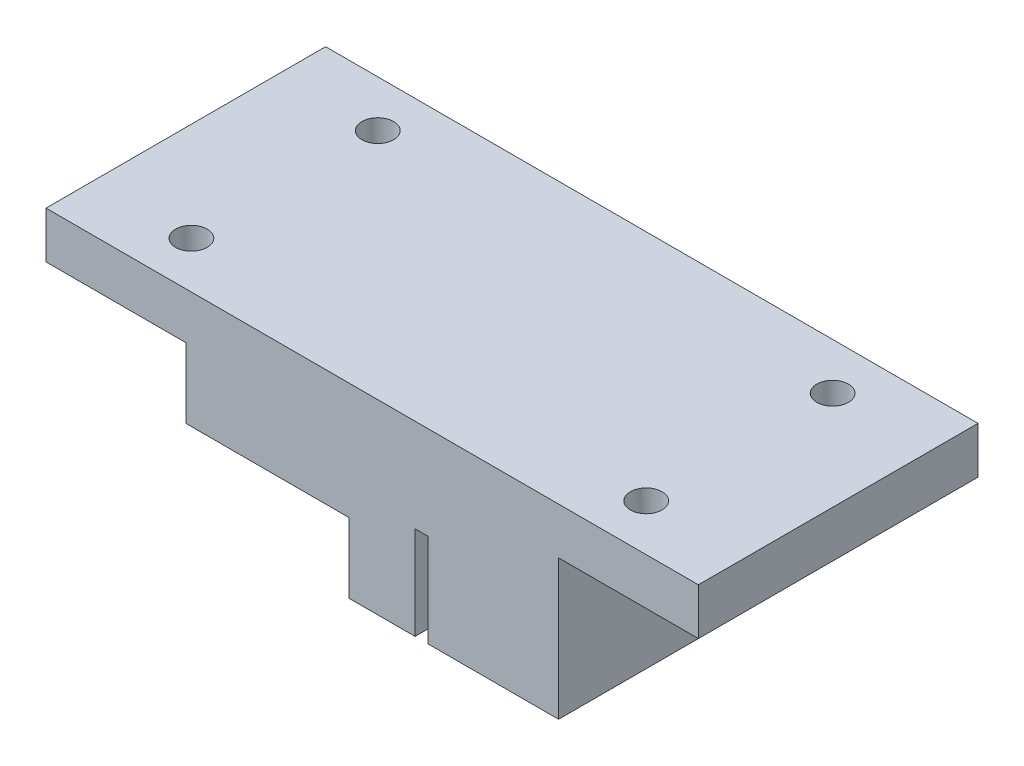
ISO-10303-21;
HEADER;
FILE_DESCRIPTION(('STEP AP214'),'2;1');
FILE_NAME('part.step','',(''),(''),'','','');
FILE_SCHEMA(('AUTOMOTIVE_DESIGN { 1 0 10303 214 1 1 1 1 }'));
ENDSEC;
DATA;
#1=APPLICATION_CONTEXT('core data for automotive mechanical design processes');
#2=APPLICATION_PROTOCOL_DEFINITION('international standard','automotive_design',2000,#1);
#3=PRODUCT_CONTEXT('',#1,'mechanical');
#4=PRODUCT('Part','Part','',(#3));
#5=PRODUCT_RELATED_PRODUCT_CATEGORY('part','',(#4));
#6=PRODUCT_DEFINITION_FORMATION('','',#4);
#7=PRODUCT_DEFINITION_CONTEXT('part definition',#1,'design');
#8=PRODUCT_DEFINITION('design','',#6,#7);
#9=PRODUCT_DEFINITION_SHAPE('','',#8);
#10=(LENGTH_UNIT() NAMED_UNIT(*) SI_UNIT(.MILLI.,.METRE.));
#11=(NAMED_UNIT(*) PLANE_ANGLE_UNIT() SI_UNIT($,.RADIAN.));
#12=(NAMED_UNIT(*) SI_UNIT($,.STERADIAN.) SOLID_ANGLE_UNIT());
#13=UNCERTAINTY_MEASURE_WITH_UNIT(LENGTH_MEASURE(1.E-05),#10,'distance_accuracy_value','');
#14=(GEOMETRIC_REPRESENTATION_CONTEXT(3) GLOBAL_UNCERTAINTY_ASSIGNED_CONTEXT((#13)) GLOBAL_UNIT_ASSIGNED_CONTEXT((#10,
#11,#12)) REPRESENTATION_CONTEXT('',''));
#15=CARTESIAN_POINT('',(0.,0.,0.));
#16=DIRECTION('',(0.,0.,1.));
#17=DIRECTION('',(1.,0.,0.));
#18=AXIS2_PLACEMENT_3D('',#15,#16,#17);
#19=CARTESIAN_POINT('',(-44.45,6.35,-19.05));
#20=DIRECTION('',(0.,0.,1.));
#21=DIRECTION('',(1.,0.,0.));
#22=AXIS2_PLACEMENT_3D('',#19,#20,#21);
#23=PLANE('',#22);
#24=DIRECTION('',(0.,-1.,0.));
#25=VECTOR('',#24,1.);
#26=CARTESIAN_POINT('',(7.62000000000001,-6.35,-19.05));
#27=LINE('',#26,#25);
#28=CARTESIAN_POINT('',(7.62000000000001,-6.35,-19.05));
#29=VERTEX_POINT('',#28);
#30=CARTESIAN_POINT('',(7.62000000000001,-19.05,-19.05));
#31=VERTEX_POINT('',#30);
#32=EDGE_CURVE('E277',#29,#31,#27,.T.);
#33=ORIENTED_EDGE('',*,*,#32,.F.);
#34=DIRECTION('',(-1.,0.,0.));
#35=VECTOR('',#34,1.);
#36=CARTESIAN_POINT('',(7.62000000000001,-6.35,-19.05));
#37=LINE('',#36,#35);
#38=CARTESIAN_POINT('',(5.84200000000001,-6.35,-19.05));
#39=VERTEX_POINT('',#38);
#40=EDGE_CURVE('E228',#29,#39,#37,.T.);
#41=ORIENTED_EDGE('',*,*,#40,.T.);
#42=DIRECTION('',(0.,-1.,0.));
#43=VECTOR('',#42,1.);
#44=CARTESIAN_POINT('',(5.84200000000001,-6.35,-19.05));
#45=LINE('',#44,#43);
#46=CARTESIAN_POINT('',(5.84200000000001,-19.05,-19.05));
#47=VERTEX_POINT('',#46);
#48=EDGE_CURVE('E274',#39,#47,#45,.T.);
#49=ORIENTED_EDGE('',*,*,#48,.T.);
#50=DIRECTION('',(1.,0.,0.));
#51=VECTOR('',#50,1.);
#52=CARTESIAN_POINT('',(-25.4,-19.05,-19.05));
#53=LINE('',#52,#51);
#54=CARTESIAN_POINT('',(-3.175,-19.05,-19.05));
#55=VERTEX_POINT('',#54);
#56=EDGE_CURVE('E310',#55,#47,#53,.T.);
#57=ORIENTED_EDGE('',*,*,#56,.F.);
#58=DIRECTION('',(0.,-1.,0.));
#59=VECTOR('',#58,1.);
#60=CARTESIAN_POINT('',(-3.175,-9.525,-19.05));
#61=LINE('',#60,#59);
#62=CARTESIAN_POINT('',(-3.175,-9.525,-19.05));
#63=VERTEX_POINT('',#62);
#64=EDGE_CURVE('E65',#63,#55,#61,.T.);
#65=ORIENTED_EDGE('',*,*,#64,.F.);
#66=DIRECTION('',(1.,0.,0.));
#67=VECTOR('',#66,1.);
#68=CARTESIAN_POINT('',(-25.4,-9.525,-19.05));
#69=LINE('',#68,#67);
#70=CARTESIAN_POINT('',(-25.4,-9.525,-19.05));
#71=VERTEX_POINT('',#70);
#72=EDGE_CURVE('E288',#71,#63,#69,.T.);
#73=ORIENTED_EDGE('',*,*,#72,.F.);
#74=DIRECTION('',(0.,1.,0.));
#75=VECTOR('',#74,1.);
#76=CARTESIAN_POINT('',(-25.4,-19.05,-19.05));
#77=LINE('',#76,#75);
#78=CARTESIAN_POINT('',(-25.4,0.,-19.05));
#79=VERTEX_POINT('',#78);
#80=EDGE_CURVE('E326',#71,#79,#77,.T.);
#81=ORIENTED_EDGE('',*,*,#80,.T.);
#82=DIRECTION('',(-1.,0.,0.));
#83=VECTOR('',#82,1.);
#84=CARTESIAN_POINT('',(-44.45,0.,-19.05));
#85=LINE('',#84,#83);
#86=CARTESIAN_POINT('',(-44.45,0.,-19.05));
#87=VERTEX_POINT('',#86);
#88=EDGE_CURVE('E355',#79,#87,#85,.T.);
#89=ORIENTED_EDGE('',*,*,#88,.T.);
#90=DIRECTION('',(0.,-1.,0.));
#91=VECTOR('',#90,1.);
#92=CARTESIAN_POINT('',(-44.45,6.35,-19.05));
#93=LINE('',#92,#91);
#94=CARTESIAN_POINT('',(-44.45,6.35,-19.05));
#95=VERTEX_POINT('',#94);
#96=EDGE_CURVE('E49',#95,#87,#93,.T.);
#97=ORIENTED_EDGE('',*,*,#96,.F.);
#98=DIRECTION('',(-1.,0.,0.));
#99=VECTOR('',#98,1.);
#100=CARTESIAN_POINT('',(-44.45,6.35,-19.05));
#101=LINE('',#100,#99);
#102=CARTESIAN_POINT('',(44.45,6.35,-19.05));
#103=VERTEX_POINT('',#102);
#104=EDGE_CURVE('E364',#103,#95,#101,.T.);
#105=ORIENTED_EDGE('',*,*,#104,.F.);
#106=DIRECTION('',(0.,-1.,0.));
#107=VECTOR('',#106,1.);
#108=CARTESIAN_POINT('',(44.45,6.35,-19.05));
#109=LINE('',#108,#107);
#110=CARTESIAN_POINT('',(44.45,0.,-19.05));
#111=VERTEX_POINT('',#110);
#112=EDGE_CURVE('E12',#103,#111,#109,.T.);
#113=ORIENTED_EDGE('',*,*,#112,.T.);
#114=CARTESIAN_POINT('',(25.4,0.,-19.05));
#115=VERTEX_POINT('',#114);
#116=EDGE_CURVE('E387',#111,#115,#85,.T.);
#117=ORIENTED_EDGE('',*,*,#116,.T.);
#118=DIRECTION('',(0.,1.,0.));
#119=VECTOR('',#118,1.);
#120=CARTESIAN_POINT('',(25.4,-19.05,-19.05));
#121=LINE('',#120,#119);
#122=CARTESIAN_POINT('',(25.4,-19.05,-19.05));
#123=VERTEX_POINT('',#122);
#124=EDGE_CURVE('E313',#123,#115,#121,.T.);
#125=ORIENTED_EDGE('',*,*,#124,.F.);
#126=EDGE_CURVE('E309',#31,#123,#53,.T.);
#127=ORIENTED_EDGE('',*,*,#126,.F.);
#128=EDGE_LOOP('',(#33,#41,#49,#57,#65,#73,#81,#89,#97,#105,#113,#117,#125,#127));
#129=FACE_BOUND('',#128,.T.);
#130=ADVANCED_FACE('F39',(#129),#23,.F.);
#131=CARTESIAN_POINT('',(-44.45,6.35,19.05));
#132=DIRECTION('',(0.,0.,-1.));
#133=DIRECTION('',(-1.,0.,0.));
#134=AXIS2_PLACEMENT_3D('',#131,#132,#133);
#135=PLANE('',#134);
#136=DIRECTION('',(0.,-1.,0.));
#137=VECTOR('',#136,1.);
#138=CARTESIAN_POINT('',(7.62,-6.35,19.0500000000001));
#139=LINE('',#138,#137);
#140=CARTESIAN_POINT('',(7.62,-6.35,19.0500000000001));
#141=VERTEX_POINT('',#140);
#142=CARTESIAN_POINT('',(7.62,-19.05,19.0500000000001));
#143=VERTEX_POINT('',#142);
#144=EDGE_CURVE('E205',#141,#143,#139,.T.);
#145=ORIENTED_EDGE('',*,*,#144,.T.);
#146=DIRECTION('',(-1.,0.,0.));
#147=VECTOR('',#146,1.);
#148=CARTESIAN_POINT('',(-25.4,-19.05,19.0500000000001));
#149=LINE('',#148,#147);
#150=CARTESIAN_POINT('',(25.4,-19.05,19.0500000000001));
#151=VERTEX_POINT('',#150);
#152=EDGE_CURVE('E307',#151,#143,#149,.T.);
#153=ORIENTED_EDGE('',*,*,#152,.F.);
#154=DIRECTION('',(0.,1.,0.));
#155=VECTOR('',#154,1.);
#156=CARTESIAN_POINT('',(25.4,-19.05,19.0500000000001));
#157=LINE('',#156,#155);
#158=CARTESIAN_POINT('',(25.4,0.,19.05));
#159=VERTEX_POINT('',#158);
#160=EDGE_CURVE('E333',#151,#159,#157,.T.);
#161=ORIENTED_EDGE('',*,*,#160,.T.);
#162=DIRECTION('',(1.,0.,0.));
#163=VECTOR('',#162,1.);
#164=CARTESIAN_POINT('',(-44.45,0.,19.05));
#165=LINE('',#164,#163);
#166=CARTESIAN_POINT('',(44.45,0.,19.05));
#167=VERTEX_POINT('',#166);
#168=EDGE_CURVE('E361',#159,#167,#165,.T.);
#169=ORIENTED_EDGE('',*,*,#168,.T.);
#170=DIRECTION('',(0.,-1.,0.));
#171=VECTOR('',#170,1.);
#172=CARTESIAN_POINT('',(44.45,6.35,19.05));
#173=LINE('',#172,#171);
#174=CARTESIAN_POINT('',(44.45,6.35,19.05));
#175=VERTEX_POINT('',#174);
#176=EDGE_CURVE('E375',#175,#167,#173,.T.);
#177=ORIENTED_EDGE('',*,*,#176,.F.);
#178=DIRECTION('',(1.,0.,0.));
#179=VECTOR('',#178,1.);
#180=CARTESIAN_POINT('',(-44.45,6.35,19.05));
#181=LINE('',#180,#179);
#182=CARTESIAN_POINT('',(-44.45,6.35,19.05));
#183=VERTEX_POINT('',#182);
#184=EDGE_CURVE('E379',#183,#175,#181,.T.);
#185=ORIENTED_EDGE('',*,*,#184,.F.);
#186=DIRECTION('',(0.,-1.,0.));
#187=VECTOR('',#186,1.);
#188=CARTESIAN_POINT('',(-44.45,6.35,19.05));
#189=LINE('',#188,#187);
#190=CARTESIAN_POINT('',(-44.45,0.,19.05));
#191=VERTEX_POINT('',#190);
#192=EDGE_CURVE('E359',#183,#191,#189,.T.);
#193=ORIENTED_EDGE('',*,*,#192,.T.);
#194=CARTESIAN_POINT('',(-25.4,0.,19.05));
#195=VERTEX_POINT('',#194);
#196=EDGE_CURVE('E354',#191,#195,#165,.T.);
#197=ORIENTED_EDGE('',*,*,#196,.T.);
#198=DIRECTION('',(0.,1.,0.));
#199=VECTOR('',#198,1.);
#200=CARTESIAN_POINT('',(-25.4,-19.05,19.0500000000001));
#201=LINE('',#200,#199);
#202=CARTESIAN_POINT('',(-25.4,-9.525,19.0500000000001));
#203=VERTEX_POINT('',#202);
#204=EDGE_CURVE('E43',#203,#195,#201,.T.);
#205=ORIENTED_EDGE('',*,*,#204,.F.);
#206=DIRECTION('',(-1.,0.,0.));
#207=VECTOR('',#206,1.);
#208=CARTESIAN_POINT('',(-25.4,-9.525,19.0500000000001));
#209=LINE('',#208,#207);
#210=CARTESIAN_POINT('',(-3.175,-9.525,19.0500000000001));
#211=VERTEX_POINT('',#210);
#212=EDGE_CURVE('E294',#211,#203,#209,.T.);
#213=ORIENTED_EDGE('',*,*,#212,.F.);
#214=DIRECTION('',(0.,-1.,0.));
#215=VECTOR('',#214,1.);
#216=CARTESIAN_POINT('',(-3.175,-9.525,19.0500000000001));
#217=LINE('',#216,#215);
#218=CARTESIAN_POINT('',(-3.175,-19.05,19.0500000000001));
#219=VERTEX_POINT('',#218);
#220=EDGE_CURVE('E297',#211,#219,#217,.T.);
#221=ORIENTED_EDGE('',*,*,#220,.T.);
#222=CARTESIAN_POINT('',(5.84200000000001,-19.05,19.0500000000001));
#223=VERTEX_POINT('',#222);
#224=EDGE_CURVE('E305',#223,#219,#149,.T.);
#225=ORIENTED_EDGE('',*,*,#224,.F.);
#226=DIRECTION('',(0.,-1.,0.));
#227=VECTOR('',#226,1.);
#228=CARTESIAN_POINT('',(5.84200000000001,-6.35,19.0500000000001));
#229=LINE('',#228,#227);
#230=CARTESIAN_POINT('',(5.84200000000001,-6.35,19.0500000000001));
#231=VERTEX_POINT('',#230);
#232=EDGE_CURVE('E57',#231,#223,#229,.T.);
#233=ORIENTED_EDGE('',*,*,#232,.F.);
#234=DIRECTION('',(1.,0.,0.));
#235=VECTOR('',#234,1.);
#236=CARTESIAN_POINT('',(5.84200000000001,-6.35,19.0500000000001));
#237=LINE('',#236,#235);
#238=EDGE_CURVE('E198',#231,#141,#237,.T.);
#239=ORIENTED_EDGE('',*,*,#238,.T.);
#240=EDGE_LOOP('',(#145,#153,#161,#169,#177,#185,#193,#197,#205,#213,#221,#225,#233,#239));
#241=FACE_BOUND('',#240,.T.);
#242=ADVANCED_FACE('F214',(#241),#135,.F.);
#243=CARTESIAN_POINT('',(0.,-19.05,0.));
#244=DIRECTION('',(0.,-1.,0.));
#245=DIRECTION('',(0.,0.,-1.));
#246=AXIS2_PLACEMENT_3D('',#243,#244,#245);
#247=PLANE('',#246);
#248=ORIENTED_EDGE('',*,*,#152,.T.);
#249=DIRECTION('',(0.,0.,-1.));
#250=VECTOR('',#249,1.);
#251=CARTESIAN_POINT('',(7.62,-19.05,19.0500000000001));
#252=LINE('',#251,#250);
#253=CARTESIAN_POINT('',(7.62000000000001,-19.05,8.12800000000011));
#254=VERTEX_POINT('',#253);
#255=EDGE_CURVE('E208',#143,#254,#252,.T.);
#256=ORIENTED_EDGE('',*,*,#255,.T.);
#257=DIRECTION('',(1.,0.,0.));
#258=VECTOR('',#257,1.);
#259=CARTESIAN_POINT('',(7.62000000000001,-19.05,8.12800000000011));
#260=LINE('',#259,#258);
#261=CARTESIAN_POINT('',(21.59,-19.05,8.12800000000011));
#262=VERTEX_POINT('',#261);
#263=EDGE_CURVE('E242',#254,#262,#260,.T.);
#264=ORIENTED_EDGE('',*,*,#263,.T.);
#265=DIRECTION('',(0.,0.,-1.));
#266=VECTOR('',#265,1.);
#267=CARTESIAN_POINT('',(21.59,-19.05,8.12800000000011));
#268=LINE('',#267,#266);
#269=CARTESIAN_POINT('',(21.59,-19.05,-8.12800000000001));
#270=VERTEX_POINT('',#269);
#271=EDGE_CURVE('E245',#262,#270,#268,.T.);
#272=ORIENTED_EDGE('',*,*,#271,.T.);
#273=DIRECTION('',(-1.,0.,0.));
#274=VECTOR('',#273,1.);
#275=CARTESIAN_POINT('',(21.59,-19.05,-8.12800000000001));
#276=LINE('',#275,#274);
#277=CARTESIAN_POINT('',(7.62000000000001,-19.05,-8.12800000000001));
#278=VERTEX_POINT('',#277);
#279=EDGE_CURVE('E248',#270,#278,#276,.T.);
#280=ORIENTED_EDGE('',*,*,#279,.T.);
#281=DIRECTION('',(0.,0.,-1.));
#282=VECTOR('',#281,1.);
#283=CARTESIAN_POINT('',(7.62000000000001,-19.05,-8.12800000000001));
#284=LINE('',#283,#282);
#285=EDGE_CURVE('E251',#278,#31,#284,.T.);
#286=ORIENTED_EDGE('',*,*,#285,.T.);
#287=ORIENTED_EDGE('',*,*,#126,.T.);
#288=DIRECTION('',(0.,0.,1.));
#289=VECTOR('',#288,1.);
#290=CARTESIAN_POINT('',(25.4,-19.05,19.0500000000001));
#291=LINE('',#290,#289);
#292=EDGE_CURVE('E302',#123,#151,#291,.T.);
#293=ORIENTED_EDGE('',*,*,#292,.T.);
#294=EDGE_LOOP('',(#248,#256,#264,#272,#280,#286,#287,#293));
#295=FACE_BOUND('',#294,.T.);
#296=ADVANCED_FACE('F442',(#295),#247,.T.);
#297=ORIENTED_EDGE('',*,*,#56,.T.);
#298=DIRECTION('',(0.,0.,1.));
#299=VECTOR('',#298,1.);
#300=CARTESIAN_POINT('',(5.84200000000001,-19.05,-19.05));
#301=LINE('',#300,#299);
#302=CARTESIAN_POINT('',(5.84200000000001,-19.05,-6.35000000000001));
#303=VERTEX_POINT('',#302);
#304=EDGE_CURVE('E254',#47,#303,#301,.T.);
#305=ORIENTED_EDGE('',*,*,#304,.T.);
#306=DIRECTION('',(1.,0.,0.));
#307=VECTOR('',#306,1.);
#308=CARTESIAN_POINT('',(5.84200000000001,-19.05,-6.35000000000001));
#309=LINE('',#308,#307);
#310=CARTESIAN_POINT('',(19.812,-19.05,-6.35000000000001));
#311=VERTEX_POINT('',#310);
#312=EDGE_CURVE('E257',#303,#311,#309,.T.);
#313=ORIENTED_EDGE('',*,*,#312,.T.);
#314=DIRECTION('',(0.,0.,1.));
#315=VECTOR('',#314,1.);
#316=CARTESIAN_POINT('',(19.812,-19.05,-6.35000000000001));
#317=LINE('',#316,#315);
#318=CARTESIAN_POINT('',(19.812,-19.05,6.35000000000011));
#319=VERTEX_POINT('',#318);
#320=EDGE_CURVE('E260',#311,#319,#317,.T.);
#321=ORIENTED_EDGE('',*,*,#320,.T.);
#322=DIRECTION('',(-1.,0.,0.));
#323=VECTOR('',#322,1.);
#324=CARTESIAN_POINT('',(19.812,-19.05,6.35000000000011));
#325=LINE('',#324,#323);
#326=CARTESIAN_POINT('',(5.84200000000001,-19.05,6.35000000000011));
#327=VERTEX_POINT('',#326);
#328=EDGE_CURVE('E218',#319,#327,#325,.T.);
#329=ORIENTED_EDGE('',*,*,#328,.T.);
#330=DIRECTION('',(0.,0.,1.));
#331=VECTOR('',#330,1.);
#332=CARTESIAN_POINT('',(5.84200000000001,-19.05,6.35000000000011));
#333=LINE('',#332,#331);
#334=EDGE_CURVE('E216',#327,#223,#333,.T.);
#335=ORIENTED_EDGE('',*,*,#334,.T.);
#336=ORIENTED_EDGE('',*,*,#224,.T.);
#337=DIRECTION('',(0.,0.,1.));
#338=VECTOR('',#337,1.);
#339=CARTESIAN_POINT('',(-3.175,-19.05,19.0500000000001));
#340=LINE('',#339,#338);
#341=EDGE_CURVE('E211',#55,#219,#340,.T.);
#342=ORIENTED_EDGE('',*,*,#341,.F.);
#343=EDGE_LOOP('',(#297,#305,#313,#321,#329,#335,#336,#342));
#344=FACE_BOUND('',#343,.T.);
#345=ADVANCED_FACE('F486',(#344),#247,.T.);
#346=CARTESIAN_POINT('',(-25.4,-19.05,19.0500000000001));
#347=DIRECTION('',(1.,0.,0.));
#348=DIRECTION('',(0.,0.,-1.));
#349=AXIS2_PLACEMENT_3D('',#346,#347,#348);
#350=PLANE('',#349);
#351=DIRECTION('',(0.,0.,-1.));
#352=VECTOR('',#351,1.);
#353=CARTESIAN_POINT('',(-25.4,-9.525,19.0500000000001));
#354=LINE('',#353,#352);
#355=EDGE_CURVE('E286',#203,#71,#354,.T.);
#356=ORIENTED_EDGE('',*,*,#355,.F.);
#357=ORIENTED_EDGE('',*,*,#204,.T.);
#358=DIRECTION('',(0.,0.,-1.));
#359=VECTOR('',#358,1.);
#360=CARTESIAN_POINT('',(-25.4,0.,19.0500000000001));
#361=LINE('',#360,#359);
#362=EDGE_CURVE('E306',#195,#79,#361,.T.);
#363=ORIENTED_EDGE('',*,*,#362,.T.);
#364=ORIENTED_EDGE('',*,*,#80,.F.);
#365=EDGE_LOOP('',(#356,#357,#363,#364));
#366=FACE_BOUND('',#365,.T.);
#367=ADVANCED_FACE('F345',(#366),#350,.F.);
#368=CARTESIAN_POINT('',(0.,0.,0.));
#369=DIRECTION('',(0.,1.,0.));
#370=DIRECTION('',(0.,0.,1.));
#371=AXIS2_PLACEMENT_3D('',#368,#369,#370);
#372=PLANE('',#371);
#373=CARTESIAN_POINT('',(30.988,0.,12.7));
#374=DIRECTION('',(0.,1.,0.));
#375=DIRECTION('',(0.,0.,1.));
#376=AXIS2_PLACEMENT_3D('',#373,#374,#375);
#377=CIRCLE('',#376,2.159);
#378=CARTESIAN_POINT('',(30.988,0.,14.859));
#379=VERTEX_POINT('',#378);
#380=EDGE_CURVE('E414',#379,#379,#377,.F.);
#381=ORIENTED_EDGE('',*,*,#380,.F.);
#382=EDGE_LOOP('',(#381));
#383=FACE_BOUND('',#382,.T.);
#384=CARTESIAN_POINT('',(30.988,0.,-12.7));
#385=DIRECTION('',(0.,1.,0.));
#386=DIRECTION('',(0.,0.,1.));
#387=AXIS2_PLACEMENT_3D('',#384,#385,#386);
#388=CIRCLE('',#387,2.159);
#389=CARTESIAN_POINT('',(30.988,0.,-10.541));
#390=VERTEX_POINT('',#389);
#391=EDGE_CURVE('E405',#390,#390,#388,.T.);
#392=ORIENTED_EDGE('',*,*,#391,.T.);
#393=EDGE_LOOP('',(#392));
#394=FACE_BOUND('',#393,.T.);
#395=DIRECTION('',(0.,0.,1.));
#396=VECTOR('',#395,1.);
#397=CARTESIAN_POINT('',(25.4,0.,19.0500000000001));
#398=LINE('',#397,#396);
#399=EDGE_CURVE('E300',#115,#159,#398,.T.);
#400=ORIENTED_EDGE('',*,*,#399,.F.);
#401=ORIENTED_EDGE('',*,*,#116,.F.);
#402=DIRECTION('',(0.,0.,-1.));
#403=VECTOR('',#402,1.);
#404=CARTESIAN_POINT('',(44.45,0.,-19.05));
#405=LINE('',#404,#403);
#406=EDGE_CURVE('E390',#167,#111,#405,.T.);
#407=ORIENTED_EDGE('',*,*,#406,.F.);
#408=ORIENTED_EDGE('',*,*,#168,.F.);
#409=EDGE_LOOP('',(#400,#401,#407,#408));
#410=FACE_BOUND('',#409,.T.);
#411=ADVANCED_FACE('F449',(#383,#394,#410),#372,.F.);
#412=CARTESIAN_POINT('',(-30.988,0.,12.7));
#413=DIRECTION('',(0.,1.,0.));
#414=DIRECTION('',(0.,0.,1.));
#415=AXIS2_PLACEMENT_3D('',#412,#413,#414);
#416=CIRCLE('',#415,2.159);
#417=CARTESIAN_POINT('',(-30.988,0.,14.859));
#418=VERTEX_POINT('',#417);
#419=EDGE_CURVE('E338',#418,#418,#416,.T.);
#420=ORIENTED_EDGE('',*,*,#419,.T.);
#421=EDGE_LOOP('',(#420));
#422=FACE_BOUND('',#421,.T.);
#423=CARTESIAN_POINT('',(-30.988,0.,-12.7));
#424=DIRECTION('',(0.,1.,0.));
#425=DIRECTION('',(0.,0.,1.));
#426=AXIS2_PLACEMENT_3D('',#423,#424,#425);
#427=CIRCLE('',#426,2.159);
#428=CARTESIAN_POINT('',(-30.988,0.,-10.541));
#429=VERTEX_POINT('',#428);
#430=EDGE_CURVE('E396',#429,#429,#427,.F.);
#431=ORIENTED_EDGE('',*,*,#430,.F.);
#432=EDGE_LOOP('',(#431));
#433=FACE_BOUND('',#432,.T.);
#434=ORIENTED_EDGE('',*,*,#362,.F.);
#435=ORIENTED_EDGE('',*,*,#196,.F.);
#436=DIRECTION('',(0.,0.,1.));
#437=VECTOR('',#436,1.);
#438=CARTESIAN_POINT('',(-44.45,0.,-19.05));
#439=LINE('',#438,#437);
#440=EDGE_CURVE('E366',#87,#191,#439,.T.);
#441=ORIENTED_EDGE('',*,*,#440,.F.);
#442=ORIENTED_EDGE('',*,*,#88,.F.);
#443=EDGE_LOOP('',(#434,#435,#441,#442));
#444=FACE_BOUND('',#443,.T.);
#445=ADVANCED_FACE('F352',(#422,#433,#444),#372,.F.);
#446=CARTESIAN_POINT('',(0.,6.35,0.));
#447=DIRECTION('',(0.,1.,0.));
#448=DIRECTION('',(0.,0.,1.));
#449=AXIS2_PLACEMENT_3D('',#446,#447,#448);
#450=PLANE('',#449);
#451=CARTESIAN_POINT('',(30.988,6.35,-12.7));
#452=DIRECTION('',(0.,1.,0.));
#453=DIRECTION('',(0.,0.,1.));
#454=AXIS2_PLACEMENT_3D('',#451,#452,#453);
#455=CIRCLE('',#454,2.159);
#456=CARTESIAN_POINT('',(30.988,6.35,-10.541));
#457=VERTEX_POINT('',#456);
#458=EDGE_CURVE('E406',#457,#457,#455,.F.);
#459=ORIENTED_EDGE('',*,*,#458,.T.);
#460=EDGE_LOOP('',(#459));
#461=FACE_BOUND('',#460,.T.);
#462=CARTESIAN_POINT('',(-30.988,6.35,-12.7));
#463=DIRECTION('',(0.,1.,0.));
#464=DIRECTION('',(0.,0.,1.));
#465=AXIS2_PLACEMENT_3D('',#462,#463,#464);
#466=CIRCLE('',#465,2.159);
#467=CARTESIAN_POINT('',(-30.988,6.35,-10.541));
#468=VERTEX_POINT('',#467);
#469=EDGE_CURVE('E402',#468,#468,#466,.T.);
#470=ORIENTED_EDGE('',*,*,#469,.F.);
#471=EDGE_LOOP('',(#470));
#472=FACE_BOUND('',#471,.T.);
#473=DIRECTION('',(0.,0.,-1.));
#474=VECTOR('',#473,1.);
#475=CARTESIAN_POINT('',(44.45,6.35,-19.05));
#476=LINE('',#475,#474);
#477=EDGE_CURVE('E360',#175,#103,#476,.T.);
#478=ORIENTED_EDGE('',*,*,#477,.T.);
#479=ORIENTED_EDGE('',*,*,#104,.T.);
#480=DIRECTION('',(0.,0.,1.));
#481=VECTOR('',#480,1.);
#482=CARTESIAN_POINT('',(-44.45,6.35,-19.05));
#483=LINE('',#482,#481);
#484=EDGE_CURVE('E385',#95,#183,#483,.T.);
#485=ORIENTED_EDGE('',*,*,#484,.T.);
#486=ORIENTED_EDGE('',*,*,#184,.T.);
#487=EDGE_LOOP('',(#478,#479,#485,#486));
#488=FACE_BOUND('',#487,.T.);
#489=CARTESIAN_POINT('',(30.988,6.35,12.7));
#490=DIRECTION('',(0.,1.,0.));
#491=DIRECTION('',(0.,0.,1.));
#492=AXIS2_PLACEMENT_3D('',#489,#490,#491);
#493=CIRCLE('',#492,2.159);
#494=CARTESIAN_POINT('',(30.988,6.35,14.859));
#495=VERTEX_POINT('',#494);
#496=EDGE_CURVE('E409',#495,#495,#493,.T.);
#497=ORIENTED_EDGE('',*,*,#496,.F.);
#498=EDGE_LOOP('',(#497));
#499=FACE_BOUND('',#498,.T.);
#500=CARTESIAN_POINT('',(-30.988,6.35,12.7));
#501=DIRECTION('',(0.,-1.,0.));
#502=DIRECTION('',(0.,0.,-1.));
#503=AXIS2_PLACEMENT_3D('',#500,#501,#502);
#504=CIRCLE('',#503,2.159);
#505=CARTESIAN_POINT('',(-30.988,6.35,10.541));
#506=VERTEX_POINT('',#505);
#507=EDGE_CURVE('E335',#506,#506,#504,.T.);
#508=ORIENTED_EDGE('',*,*,#507,.T.);
#509=EDGE_LOOP('',(#508));
#510=FACE_BOUND('',#509,.T.);
#511=ADVANCED_FACE('F453',(#461,#472,#488,#499,#510),#450,.T.);
#512=CARTESIAN_POINT('',(44.45,6.35,-19.05));
#513=DIRECTION('',(-1.,0.,0.));
#514=DIRECTION('',(0.,0.,1.));
#515=AXIS2_PLACEMENT_3D('',#512,#513,#514);
#516=PLANE('',#515);
#517=ORIENTED_EDGE('',*,*,#406,.T.);
#518=ORIENTED_EDGE('',*,*,#112,.F.);
#519=ORIENTED_EDGE('',*,*,#477,.F.);
#520=ORIENTED_EDGE('',*,*,#176,.T.);
#521=EDGE_LOOP('',(#517,#518,#519,#520));
#522=FACE_BOUND('',#521,.T.);
#523=ADVANCED_FACE('F41',(#522),#516,.F.);
#524=CARTESIAN_POINT('',(-44.45,6.35,-19.05));
#525=DIRECTION('',(1.,0.,0.));
#526=DIRECTION('',(0.,0.,-1.));
#527=AXIS2_PLACEMENT_3D('',#524,#525,#526);
#528=PLANE('',#527);
#529=ORIENTED_EDGE('',*,*,#440,.T.);
#530=ORIENTED_EDGE('',*,*,#192,.F.);
#531=ORIENTED_EDGE('',*,*,#484,.F.);
#532=ORIENTED_EDGE('',*,*,#96,.T.);
#533=EDGE_LOOP('',(#529,#530,#531,#532));
#534=FACE_BOUND('',#533,.T.);
#535=ADVANCED_FACE('F384',(#534),#528,.F.);
#536=CARTESIAN_POINT('',(-30.988,-0.00100000000000013,-12.7));
#537=DIRECTION('',(0.,1.,0.));
#538=DIRECTION('',(0.,0.,1.));
#539=AXIS2_PLACEMENT_3D('',#536,#537,#538);
#540=CYLINDRICAL_SURFACE('',#539,2.159);
#541=ORIENTED_EDGE('',*,*,#469,.T.);
#542=EDGE_LOOP('',(#541));
#543=FACE_BOUND('',#542,.T.);
#544=ORIENTED_EDGE('',*,*,#430,.T.);
#545=EDGE_LOOP('',(#544));
#546=FACE_BOUND('',#545,.T.);
#547=ADVANCED_FACE('F447',(#543,#546),#540,.F.);
#548=CARTESIAN_POINT('',(30.988,-0.00100000000000013,-12.7));
#549=DIRECTION('',(0.,1.,0.));
#550=DIRECTION('',(0.,0.,1.));
#551=AXIS2_PLACEMENT_3D('',#548,#549,#550);
#552=CYLINDRICAL_SURFACE('',#551,2.159);
#553=ORIENTED_EDGE('',*,*,#458,.F.);
#554=EDGE_LOOP('',(#553));
#555=FACE_BOUND('',#554,.T.);
#556=ORIENTED_EDGE('',*,*,#391,.F.);
#557=EDGE_LOOP('',(#556));
#558=FACE_BOUND('',#557,.T.);
#559=ADVANCED_FACE('F434',(#555,#558),#552,.F.);
#560=CARTESIAN_POINT('',(30.988,-0.00100000000000013,12.7));
#561=DIRECTION('',(0.,1.,0.));
#562=DIRECTION('',(0.,0.,1.));
#563=AXIS2_PLACEMENT_3D('',#560,#561,#562);
#564=CYLINDRICAL_SURFACE('',#563,2.159);
#565=ORIENTED_EDGE('',*,*,#496,.T.);
#566=EDGE_LOOP('',(#565));
#567=FACE_BOUND('',#566,.T.);
#568=ORIENTED_EDGE('',*,*,#380,.T.);
#569=EDGE_LOOP('',(#568));
#570=FACE_BOUND('',#569,.T.);
#571=ADVANCED_FACE('F424',(#567,#570),#564,.F.);
#572=CARTESIAN_POINT('',(-30.988,-0.00100000000000013,12.7));
#573=DIRECTION('',(0.,1.,0.));
#574=DIRECTION('',(0.,0.,1.));
#575=AXIS2_PLACEMENT_3D('',#572,#573,#574);
#576=CYLINDRICAL_SURFACE('',#575,2.159);
#577=ORIENTED_EDGE('',*,*,#507,.F.);
#578=EDGE_LOOP('',(#577));
#579=FACE_BOUND('',#578,.T.);
#580=ORIENTED_EDGE('',*,*,#419,.F.);
#581=EDGE_LOOP('',(#580));
#582=FACE_BOUND('',#581,.T.);
#583=ADVANCED_FACE('F421',(#579,#582),#576,.F.);
#584=CARTESIAN_POINT('',(25.4,-19.05,19.0500000000001));
#585=DIRECTION('',(-1.,0.,0.));
#586=DIRECTION('',(0.,0.,1.));
#587=AXIS2_PLACEMENT_3D('',#584,#585,#586);
#588=PLANE('',#587);
#589=ORIENTED_EDGE('',*,*,#399,.T.);
#590=ORIENTED_EDGE('',*,*,#160,.F.);
#591=ORIENTED_EDGE('',*,*,#292,.F.);
#592=ORIENTED_EDGE('',*,*,#124,.T.);
#593=EDGE_LOOP('',(#589,#590,#591,#592));
#594=FACE_BOUND('',#593,.T.);
#595=ADVANCED_FACE('F423',(#594),#588,.F.);
#596=CARTESIAN_POINT('',(-3.175,-9.525,19.0500000000001));
#597=DIRECTION('',(1.,0.,0.));
#598=DIRECTION('',(0.,0.,-1.));
#599=AXIS2_PLACEMENT_3D('',#596,#597,#598);
#600=PLANE('',#599);
#601=ORIENTED_EDGE('',*,*,#341,.T.);
#602=ORIENTED_EDGE('',*,*,#220,.F.);
#603=DIRECTION('',(0.,0.,1.));
#604=VECTOR('',#603,1.);
#605=CARTESIAN_POINT('',(-3.175,-9.525,19.0500000000001));
#606=LINE('',#605,#604);
#607=EDGE_CURVE('E291',#63,#211,#606,.T.);
#608=ORIENTED_EDGE('',*,*,#607,.F.);
#609=ORIENTED_EDGE('',*,*,#64,.T.);
#610=EDGE_LOOP('',(#601,#602,#608,#609));
#611=FACE_BOUND('',#610,.T.);
#612=ADVANCED_FACE('F431',(#611),#600,.F.);
#613=CARTESIAN_POINT('',(0.,-9.525,0.));
#614=DIRECTION('',(0.,-1.,0.));
#615=DIRECTION('',(0.,0.,-1.));
#616=AXIS2_PLACEMENT_3D('',#613,#614,#615);
#617=PLANE('',#616);
#618=ORIENTED_EDGE('',*,*,#355,.T.);
#619=ORIENTED_EDGE('',*,*,#72,.T.);
#620=ORIENTED_EDGE('',*,*,#607,.T.);
#621=ORIENTED_EDGE('',*,*,#212,.T.);
#622=EDGE_LOOP('',(#618,#619,#620,#621));
#623=FACE_BOUND('',#622,.T.);
#624=ADVANCED_FACE('F488',(#623),#617,.T.);
#625=CARTESIAN_POINT('',(7.62,-6.35,19.0500000000001));
#626=DIRECTION('',(-1.,0.,0.));
#627=DIRECTION('',(0.,0.,1.));
#628=AXIS2_PLACEMENT_3D('',#625,#626,#627);
#629=PLANE('',#628);
#630=ORIENTED_EDGE('',*,*,#255,.F.);
#631=ORIENTED_EDGE('',*,*,#144,.F.);
#632=DIRECTION('',(0.,0.,-1.));
#633=VECTOR('',#632,1.);
#634=CARTESIAN_POINT('',(7.62,-6.35,19.0500000000001));
#635=LINE('',#634,#633);
#636=CARTESIAN_POINT('',(7.62000000000001,-6.35,8.12800000000011));
#637=VERTEX_POINT('',#636);
#638=EDGE_CURVE('E193',#141,#637,#635,.T.);
#639=ORIENTED_EDGE('',*,*,#638,.T.);
#640=DIRECTION('',(0.,-1.,0.));
#641=VECTOR('',#640,1.);
#642=CARTESIAN_POINT('',(7.62000000000001,-6.35,8.12800000000011));
#643=LINE('',#642,#641);
#644=EDGE_CURVE('E212',#637,#254,#643,.T.);
#645=ORIENTED_EDGE('',*,*,#644,.T.);
#646=EDGE_LOOP('',(#630,#631,#639,#645));
#647=FACE_BOUND('',#646,.T.);
#648=ADVANCED_FACE('F206',(#647),#629,.T.);
#649=CARTESIAN_POINT('',(7.62000000000001,-6.35,8.12800000000011));
#650=DIRECTION('',(0.,0.,-1.));
#651=DIRECTION('',(-1.,0.,0.));
#652=AXIS2_PLACEMENT_3D('',#649,#650,#651);
#653=PLANE('',#652);
#654=ORIENTED_EDGE('',*,*,#263,.F.);
#655=ORIENTED_EDGE('',*,*,#644,.F.);
#656=DIRECTION('',(1.,0.,0.));
#657=VECTOR('',#656,1.);
#658=CARTESIAN_POINT('',(7.62000000000001,-6.35,8.12800000000011));
#659=LINE('',#658,#657);
#660=CARTESIAN_POINT('',(21.59,-6.35,8.12800000000011));
#661=VERTEX_POINT('',#660);
#662=EDGE_CURVE('E200',#637,#661,#659,.T.);
#663=ORIENTED_EDGE('',*,*,#662,.T.);
#664=DIRECTION('',(0.,-1.,0.));
#665=VECTOR('',#664,1.);
#666=CARTESIAN_POINT('',(21.59,-6.35,8.12800000000011));
#667=LINE('',#666,#665);
#668=EDGE_CURVE('E283',#661,#262,#667,.T.);
#669=ORIENTED_EDGE('',*,*,#668,.T.);
#670=EDGE_LOOP('',(#654,#655,#663,#669));
#671=FACE_BOUND('',#670,.T.);
#672=ADVANCED_FACE('F496',(#671),#653,.T.);
#673=CARTESIAN_POINT('',(21.59,-6.35,8.12800000000011));
#674=DIRECTION('',(-1.,0.,0.));
#675=DIRECTION('',(0.,0.,1.));
#676=AXIS2_PLACEMENT_3D('',#673,#674,#675);
#677=PLANE('',#676);
#678=ORIENTED_EDGE('',*,*,#271,.F.);
#679=ORIENTED_EDGE('',*,*,#668,.F.);
#680=DIRECTION('',(0.,0.,-1.));
#681=VECTOR('',#680,1.);
#682=CARTESIAN_POINT('',(21.59,-6.35,8.12800000000011));
#683=LINE('',#682,#681);
#684=CARTESIAN_POINT('',(21.59,-6.35,-8.12800000000001));
#685=VERTEX_POINT('',#684);
#686=EDGE_CURVE('E222',#661,#685,#683,.T.);
#687=ORIENTED_EDGE('',*,*,#686,.T.);
#688=DIRECTION('',(0.,-1.,0.));
#689=VECTOR('',#688,1.);
#690=CARTESIAN_POINT('',(21.59,-6.35,-8.12800000000001));
#691=LINE('',#690,#689);
#692=EDGE_CURVE('E281',#685,#270,#691,.T.);
#693=ORIENTED_EDGE('',*,*,#692,.T.);
#694=EDGE_LOOP('',(#678,#679,#687,#693));
#695=FACE_BOUND('',#694,.T.);
#696=ADVANCED_FACE('F631',(#695),#677,.T.);
#697=CARTESIAN_POINT('',(21.59,-6.35,-8.12800000000001));
#698=DIRECTION('',(0.,0.,1.));
#699=DIRECTION('',(1.,0.,0.));
#700=AXIS2_PLACEMENT_3D('',#697,#698,#699);
#701=PLANE('',#700);
#702=ORIENTED_EDGE('',*,*,#279,.F.);
#703=ORIENTED_EDGE('',*,*,#692,.F.);
#704=DIRECTION('',(-1.,0.,0.));
#705=VECTOR('',#704,1.);
#706=CARTESIAN_POINT('',(21.59,-6.35,-8.12800000000001));
#707=LINE('',#706,#705);
#708=CARTESIAN_POINT('',(7.62000000000001,-6.35,-8.12800000000001));
#709=VERTEX_POINT('',#708);
#710=EDGE_CURVE('E224',#685,#709,#707,.T.);
#711=ORIENTED_EDGE('',*,*,#710,.T.);
#712=DIRECTION('',(0.,-1.,0.));
#713=VECTOR('',#712,1.);
#714=CARTESIAN_POINT('',(7.62000000000001,-6.35,-8.12800000000001));
#715=LINE('',#714,#713);
#716=EDGE_CURVE('E279',#709,#278,#715,.T.);
#717=ORIENTED_EDGE('',*,*,#716,.T.);
#718=EDGE_LOOP('',(#702,#703,#711,#717));
#719=FACE_BOUND('',#718,.T.);
#720=ADVANCED_FACE('F639',(#719),#701,.T.);
#721=CARTESIAN_POINT('',(7.62000000000001,-6.35,-8.12800000000001));
#722=DIRECTION('',(-1.,0.,0.));
#723=DIRECTION('',(0.,0.,1.));
#724=AXIS2_PLACEMENT_3D('',#721,#722,#723);
#725=PLANE('',#724);
#726=ORIENTED_EDGE('',*,*,#285,.F.);
#727=ORIENTED_EDGE('',*,*,#716,.F.);
#728=DIRECTION('',(0.,0.,-1.));
#729=VECTOR('',#728,1.);
#730=CARTESIAN_POINT('',(7.62000000000001,-6.35,-8.12800000000001));
#731=LINE('',#730,#729);
#732=EDGE_CURVE('E226',#709,#29,#731,.T.);
#733=ORIENTED_EDGE('',*,*,#732,.T.);
#734=ORIENTED_EDGE('',*,*,#32,.T.);
#735=EDGE_LOOP('',(#726,#727,#733,#734));
#736=FACE_BOUND('',#735,.T.);
#737=ADVANCED_FACE('F477',(#736),#725,.T.);
#738=CARTESIAN_POINT('',(5.84200000000001,-6.35,-19.05));
#739=DIRECTION('',(1.,0.,0.));
#740=DIRECTION('',(0.,0.,-1.));
#741=AXIS2_PLACEMENT_3D('',#738,#739,#740);
#742=PLANE('',#741);
#743=ORIENTED_EDGE('',*,*,#304,.F.);
#744=ORIENTED_EDGE('',*,*,#48,.F.);
#745=DIRECTION('',(0.,0.,1.));
#746=VECTOR('',#745,1.);
#747=CARTESIAN_POINT('',(5.84200000000001,-6.35,-19.05));
#748=LINE('',#747,#746);
#749=CARTESIAN_POINT('',(5.84200000000001,-6.35,-6.35000000000001));
#750=VERTEX_POINT('',#749);
#751=EDGE_CURVE('E231',#39,#750,#748,.T.);
#752=ORIENTED_EDGE('',*,*,#751,.T.);
#753=DIRECTION('',(0.,-1.,0.));
#754=VECTOR('',#753,1.);
#755=CARTESIAN_POINT('',(5.84200000000001,-6.35,-6.35000000000001));
#756=LINE('',#755,#754);
#757=EDGE_CURVE('E272',#750,#303,#756,.T.);
#758=ORIENTED_EDGE('',*,*,#757,.T.);
#759=EDGE_LOOP('',(#743,#744,#752,#758));
#760=FACE_BOUND('',#759,.T.);
#761=ADVANCED_FACE('F656',(#760),#742,.T.);
#762=CARTESIAN_POINT('',(5.84200000000001,-6.35,-6.35000000000001));
#763=DIRECTION('',(0.,0.,-1.));
#764=DIRECTION('',(-1.,0.,0.));
#765=AXIS2_PLACEMENT_3D('',#762,#763,#764);
#766=PLANE('',#765);
#767=ORIENTED_EDGE('',*,*,#312,.F.);
#768=ORIENTED_EDGE('',*,*,#757,.F.);
#769=DIRECTION('',(1.,0.,0.));
#770=VECTOR('',#769,1.);
#771=CARTESIAN_POINT('',(5.84200000000001,-6.35,-6.35000000000001));
#772=LINE('',#771,#770);
#773=CARTESIAN_POINT('',(19.812,-6.35,-6.35000000000001));
#774=VERTEX_POINT('',#773);
#775=EDGE_CURVE('E233',#750,#774,#772,.T.);
#776=ORIENTED_EDGE('',*,*,#775,.T.);
#777=DIRECTION('',(0.,-1.,0.));
#778=VECTOR('',#777,1.);
#779=CARTESIAN_POINT('',(19.812,-6.35,-6.35000000000001));
#780=LINE('',#779,#778);
#781=EDGE_CURVE('E270',#774,#311,#780,.T.);
#782=ORIENTED_EDGE('',*,*,#781,.T.);
#783=EDGE_LOOP('',(#767,#768,#776,#782));
#784=FACE_BOUND('',#783,.T.);
#785=ADVANCED_FACE('F664',(#784),#766,.T.);
#786=CARTESIAN_POINT('',(19.812,-6.35,-6.35000000000001));
#787=DIRECTION('',(1.,0.,0.));
#788=DIRECTION('',(0.,0.,-1.));
#789=AXIS2_PLACEMENT_3D('',#786,#787,#788);
#790=PLANE('',#789);
#791=ORIENTED_EDGE('',*,*,#320,.F.);
#792=ORIENTED_EDGE('',*,*,#781,.F.);
#793=DIRECTION('',(0.,0.,1.));
#794=VECTOR('',#793,1.);
#795=CARTESIAN_POINT('',(19.812,-6.35,-6.35000000000001));
#796=LINE('',#795,#794);
#797=CARTESIAN_POINT('',(19.812,-6.35,6.35000000000011));
#798=VERTEX_POINT('',#797);
#799=EDGE_CURVE('E235',#774,#798,#796,.T.);
#800=ORIENTED_EDGE('',*,*,#799,.T.);
#801=DIRECTION('',(0.,-1.,0.));
#802=VECTOR('',#801,1.);
#803=CARTESIAN_POINT('',(19.812,-6.35,6.35000000000011));
#804=LINE('',#803,#802);
#805=EDGE_CURVE('E268',#798,#319,#804,.T.);
#806=ORIENTED_EDGE('',*,*,#805,.T.);
#807=EDGE_LOOP('',(#791,#792,#800,#806));
#808=FACE_BOUND('',#807,.T.);
#809=ADVANCED_FACE('F672',(#808),#790,.T.);
#810=CARTESIAN_POINT('',(19.812,-6.35,6.35000000000011));
#811=DIRECTION('',(0.,0.,1.));
#812=DIRECTION('',(1.,0.,0.));
#813=AXIS2_PLACEMENT_3D('',#810,#811,#812);
#814=PLANE('',#813);
#815=ORIENTED_EDGE('',*,*,#328,.F.);
#816=ORIENTED_EDGE('',*,*,#805,.F.);
#817=DIRECTION('',(-1.,0.,0.));
#818=VECTOR('',#817,1.);
#819=CARTESIAN_POINT('',(19.812,-6.35,6.35000000000011));
#820=LINE('',#819,#818);
#821=CARTESIAN_POINT('',(5.84200000000001,-6.35,6.35000000000011));
#822=VERTEX_POINT('',#821);
#823=EDGE_CURVE('E237',#798,#822,#820,.T.);
#824=ORIENTED_EDGE('',*,*,#823,.T.);
#825=DIRECTION('',(0.,-1.,0.));
#826=VECTOR('',#825,1.);
#827=CARTESIAN_POINT('',(5.84200000000001,-6.35,6.35000000000011));
#828=LINE('',#827,#826);
#829=EDGE_CURVE('E266',#822,#327,#828,.T.);
#830=ORIENTED_EDGE('',*,*,#829,.T.);
#831=EDGE_LOOP('',(#815,#816,#824,#830));
#832=FACE_BOUND('',#831,.T.);
#833=ADVANCED_FACE('F681',(#832),#814,.T.);
#834=CARTESIAN_POINT('',(5.84200000000001,-6.35,6.35000000000011));
#835=DIRECTION('',(1.,0.,0.));
#836=DIRECTION('',(0.,0.,-1.));
#837=AXIS2_PLACEMENT_3D('',#834,#835,#836);
#838=PLANE('',#837);
#839=ORIENTED_EDGE('',*,*,#334,.F.);
#840=ORIENTED_EDGE('',*,*,#829,.F.);
#841=DIRECTION('',(0.,0.,1.));
#842=VECTOR('',#841,1.);
#843=CARTESIAN_POINT('',(5.84200000000001,-6.35,6.35000000000011));
#844=LINE('',#843,#842);
#845=EDGE_CURVE('E239',#822,#231,#844,.T.);
#846=ORIENTED_EDGE('',*,*,#845,.T.);
#847=ORIENTED_EDGE('',*,*,#232,.T.);
#848=EDGE_LOOP('',(#839,#840,#846,#847));
#849=FACE_BOUND('',#848,.T.);
#850=ADVANCED_FACE('F690',(#849),#838,.T.);
#851=CARTESIAN_POINT('',(0.,-6.35,0.));
#852=DIRECTION('',(0.,1.,0.));
#853=DIRECTION('',(0.,0.,1.));
#854=AXIS2_PLACEMENT_3D('',#851,#852,#853);
#855=PLANE('',#854);
#856=ORIENTED_EDGE('',*,*,#238,.F.);
#857=ORIENTED_EDGE('',*,*,#845,.F.);
#858=ORIENTED_EDGE('',*,*,#823,.F.);
#859=ORIENTED_EDGE('',*,*,#799,.F.);
#860=ORIENTED_EDGE('',*,*,#775,.F.);
#861=ORIENTED_EDGE('',*,*,#751,.F.);
#862=ORIENTED_EDGE('',*,*,#40,.F.);
#863=ORIENTED_EDGE('',*,*,#732,.F.);
#864=ORIENTED_EDGE('',*,*,#710,.F.);
#865=ORIENTED_EDGE('',*,*,#686,.F.);
#866=ORIENTED_EDGE('',*,*,#662,.F.);
#867=ORIENTED_EDGE('',*,*,#638,.F.);
#868=EDGE_LOOP('',(#856,#857,#858,#859,#860,#861,#862,#863,#864,#865,#866,#867));
#869=FACE_BOUND('',#868,.T.);
#870=ADVANCED_FACE('F195',(#869),#855,.F.);
#871=CLOSED_SHELL('',(#130,#242,#296,#345,#367,#411,#445,#511,#523,#535,#547,#559,#571,#583,
#595,#612,#624,#648,#672,#696,#720,#737,#761,#785,#809,#833,#850,#870));
#872=MANIFOLD_SOLID_BREP('B2',#871);
#873=ADVANCED_BREP_SHAPE_REPRESENTATION('',(#18,#872),#14);
#874=SHAPE_DEFINITION_REPRESENTATION(#9,#873);
ENDSEC;
END-ISO-10303-21;
